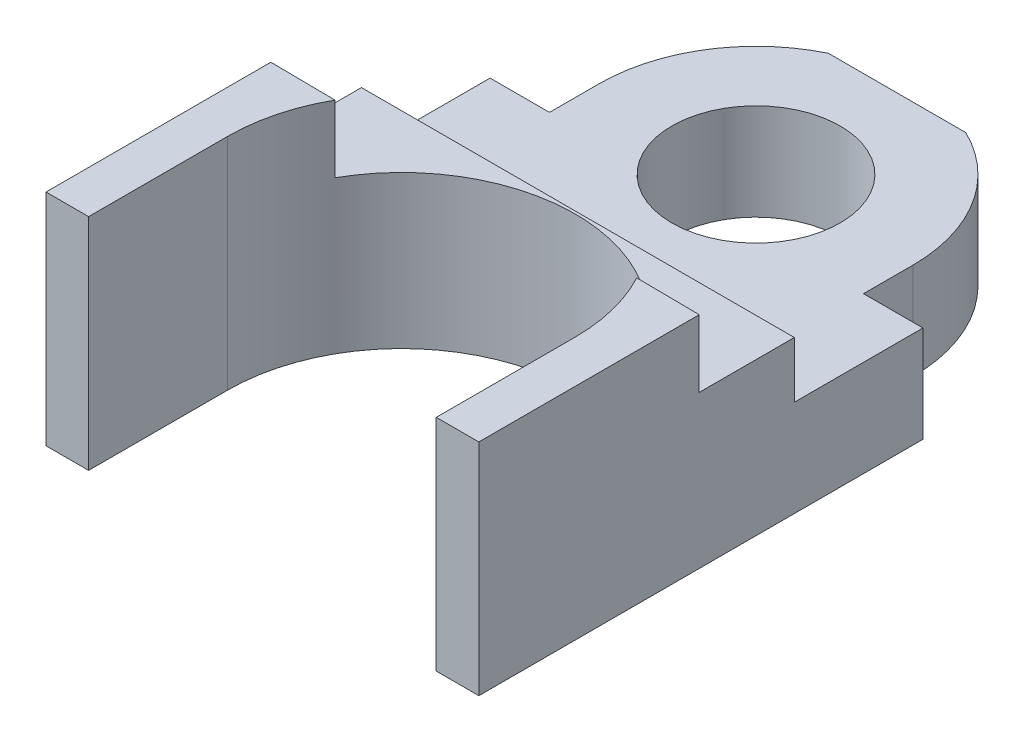
ISO-10303-21;
HEADER;
FILE_DESCRIPTION(('STEP AP214'),'2;1');
FILE_NAME('part.step','',(''),(''),'','','');
FILE_SCHEMA(('AUTOMOTIVE_DESIGN { 1 0 10303 214 1 1 1 1 }'));
ENDSEC;
DATA;
#1=APPLICATION_CONTEXT('core data for automotive mechanical design processes');
#2=APPLICATION_PROTOCOL_DEFINITION('international standard','automotive_design',2000,#1);
#3=PRODUCT_CONTEXT('',#1,'mechanical');
#4=PRODUCT('Part','Part','',(#3));
#5=PRODUCT_RELATED_PRODUCT_CATEGORY('part','',(#4));
#6=PRODUCT_DEFINITION_FORMATION('','',#4);
#7=PRODUCT_DEFINITION_CONTEXT('part definition',#1,'design');
#8=PRODUCT_DEFINITION('design','',#6,#7);
#9=PRODUCT_DEFINITION_SHAPE('','',#8);
#10=(LENGTH_UNIT() NAMED_UNIT(*) SI_UNIT(.MILLI.,.METRE.));
#11=(NAMED_UNIT(*) PLANE_ANGLE_UNIT() SI_UNIT($,.RADIAN.));
#12=(NAMED_UNIT(*) SI_UNIT($,.STERADIAN.) SOLID_ANGLE_UNIT());
#13=UNCERTAINTY_MEASURE_WITH_UNIT(LENGTH_MEASURE(1.E-05),#10,'distance_accuracy_value','');
#14=(GEOMETRIC_REPRESENTATION_CONTEXT(3) GLOBAL_UNCERTAINTY_ASSIGNED_CONTEXT((#13)) GLOBAL_UNIT_ASSIGNED_CONTEXT((#10,
#11,#12)) REPRESENTATION_CONTEXT('',''));
#15=CARTESIAN_POINT('',(0.,0.,0.));
#16=DIRECTION('',(0.,0.,1.));
#17=DIRECTION('',(1.,0.,0.));
#18=AXIS2_PLACEMENT_3D('',#15,#16,#17);
#19=CARTESIAN_POINT('',(0.,9.8,-5.73407202216066));
#20=DIRECTION('',(0.,0.,-1.));
#21=DIRECTION('',(-1.,0.,0.));
#22=AXIS2_PLACEMENT_3D('',#19,#20,#21);
#23=PLANE('',#22);
#24=DIRECTION('',(0.,-1.,0.));
#25=VECTOR('',#24,1.);
#26=CARTESIAN_POINT('',(11.5832409972299,9.8,-5.73407202216066));
#27=LINE('',#26,#25);
#28=CARTESIAN_POINT('',(11.5832409972299,4.3,-5.73407202216066));
#29=VERTEX_POINT('',#28);
#30=CARTESIAN_POINT('',(11.5832409972299,0.,-5.73407202216066));
#31=VERTEX_POINT('',#30);
#32=EDGE_CURVE('E322',#29,#31,#27,.T.);
#33=ORIENTED_EDGE('',*,*,#32,.F.);
#34=DIRECTION('',(1.,0.,0.));
#35=VECTOR('',#34,1.);
#36=CARTESIAN_POINT('',(0.,4.3,-5.73407202216066));
#37=LINE('',#36,#35);
#38=CARTESIAN_POINT('',(14.2332409972299,4.3,-5.73407202216066));
#39=VERTEX_POINT('',#38);
#40=EDGE_CURVE('E391',#29,#39,#37,.T.);
#41=ORIENTED_EDGE('',*,*,#40,.T.);
#42=DIRECTION('',(0.,-1.,0.));
#43=VECTOR('',#42,1.);
#44=CARTESIAN_POINT('',(14.2332409972299,9.8,-5.73407202216066));
#45=LINE('',#44,#43);
#46=CARTESIAN_POINT('',(14.2332409972299,0.,-5.73407202216066));
#47=VERTEX_POINT('',#46);
#48=EDGE_CURVE('E325',#39,#47,#45,.T.);
#49=ORIENTED_EDGE('',*,*,#48,.T.);
#50=DIRECTION('',(1.,0.,0.));
#51=VECTOR('',#50,1.);
#52=CARTESIAN_POINT('',(0.,0.,-5.73407202216066));
#53=LINE('',#52,#51);
#54=EDGE_CURVE('E255',#31,#47,#53,.T.);
#55=ORIENTED_EDGE('',*,*,#54,.F.);
#56=EDGE_LOOP('',(#33,#41,#49,#55));
#57=FACE_BOUND('',#56,.T.);
#58=ADVANCED_FACE('F39',(#57),#23,.T.);
#59=CARTESIAN_POINT('',(11.5832409972299,9.8,0.));
#60=DIRECTION('',(1.,0.,0.));
#61=DIRECTION('',(0.,0.,-1.));
#62=AXIS2_PLACEMENT_3D('',#59,#60,#61);
#63=PLANE('',#62);
#64=DIRECTION('',(0.,-1.,0.));
#65=VECTOR('',#64,1.);
#66=CARTESIAN_POINT('',(11.5832409972299,9.8,-7.9404432132964));
#67=LINE('',#66,#65);
#68=CARTESIAN_POINT('',(11.5832409972299,4.3,-7.9404432132964));
#69=VERTEX_POINT('',#68);
#70=CARTESIAN_POINT('',(11.5832409972299,0.,-7.9404432132964));
#71=VERTEX_POINT('',#70);
#72=EDGE_CURVE('E319',#69,#71,#67,.T.);
#73=ORIENTED_EDGE('',*,*,#72,.F.);
#74=DIRECTION('',(0.,0.,1.));
#75=VECTOR('',#74,1.);
#76=CARTESIAN_POINT('',(11.5832409972299,4.3,0.));
#77=LINE('',#76,#75);
#78=EDGE_CURVE('E395',#69,#29,#77,.T.);
#79=ORIENTED_EDGE('',*,*,#78,.T.);
#80=ORIENTED_EDGE('',*,*,#32,.T.);
#81=DIRECTION('',(0.,0.,1.));
#82=VECTOR('',#81,1.);
#83=CARTESIAN_POINT('',(11.5832409972299,0.,0.));
#84=LINE('',#83,#82);
#85=EDGE_CURVE('E259',#71,#31,#84,.T.);
#86=ORIENTED_EDGE('',*,*,#85,.F.);
#87=EDGE_LOOP('',(#73,#79,#80,#86));
#88=FACE_BOUND('',#87,.T.);
#89=ADVANCED_FACE('F444',(#88),#63,.T.);
#90=CARTESIAN_POINT('',(4.58324099722992,9.8,-7.9404432132964));
#91=DIRECTION('',(0.,-1.,0.));
#92=DIRECTION('',(0.,0.,-1.));
#93=AXIS2_PLACEMENT_3D('',#90,#91,#92);
#94=CYLINDRICAL_SURFACE('',#93,7.);
#95=CARTESIAN_POINT('',(4.58324099722992,4.3,-7.9404432132964));
#96=DIRECTION('',(0.,1.,0.));
#97=DIRECTION('',(0.,0.,1.));
#98=AXIS2_PLACEMENT_3D('',#95,#96,#97);
#99=CIRCLE('',#98,7.);
#100=CARTESIAN_POINT('',(7.64759026195706,4.3,-14.2340720221607));
#101=VERTEX_POINT('',#100);
#102=EDGE_CURVE('E399',#69,#101,#99,.T.);
#103=ORIENTED_EDGE('',*,*,#102,.F.);
#104=ORIENTED_EDGE('',*,*,#72,.T.);
#105=CARTESIAN_POINT('',(4.58324099722992,0.,-7.9404432132964));
#106=DIRECTION('',(0.,1.,0.));
#107=DIRECTION('',(0.,0.,1.));
#108=AXIS2_PLACEMENT_3D('',#105,#106,#107);
#109=CIRCLE('',#108,7.);
#110=CARTESIAN_POINT('',(7.64759026195706,0.,-14.2340720221607));
#111=VERTEX_POINT('',#110);
#112=EDGE_CURVE('E263',#71,#111,#109,.T.);
#113=ORIENTED_EDGE('',*,*,#112,.T.);
#114=DIRECTION('',(0.,-1.,0.));
#115=VECTOR('',#114,1.);
#116=CARTESIAN_POINT('',(7.64759026195706,9.8,-14.2340720221607));
#117=LINE('',#116,#115);
#118=EDGE_CURVE('E316',#101,#111,#117,.T.);
#119=ORIENTED_EDGE('',*,*,#118,.F.);
#120=EDGE_LOOP('',(#103,#104,#113,#119));
#121=FACE_BOUND('',#120,.T.);
#122=ADVANCED_FACE('F450',(#121),#94,.T.);
#123=CARTESIAN_POINT('',(0.,9.8,-14.2340720221607));
#124=DIRECTION('',(0.,0.,1.));
#125=DIRECTION('',(1.,0.,0.));
#126=AXIS2_PLACEMENT_3D('',#123,#124,#125);
#127=PLANE('',#126);
#128=DIRECTION('',(-1.,0.,0.));
#129=VECTOR('',#128,1.);
#130=CARTESIAN_POINT('',(0.,4.3,-14.2340720221607));
#131=LINE('',#130,#129);
#132=CARTESIAN_POINT('',(1.51889173250277,4.3,-14.2340720221607));
#133=VERTEX_POINT('',#132);
#134=EDGE_CURVE('E402',#101,#133,#131,.T.);
#135=ORIENTED_EDGE('',*,*,#134,.F.);
#136=ORIENTED_EDGE('',*,*,#118,.T.);
#137=DIRECTION('',(-1.,0.,0.));
#138=VECTOR('',#137,1.);
#139=CARTESIAN_POINT('',(0.,0.,-14.2340720221607));
#140=LINE('',#139,#138);
#141=CARTESIAN_POINT('',(1.51889173250277,0.,-14.2340720221607));
#142=VERTEX_POINT('',#141);
#143=EDGE_CURVE('E267',#111,#142,#140,.T.);
#144=ORIENTED_EDGE('',*,*,#143,.T.);
#145=DIRECTION('',(0.,-1.,0.));
#146=VECTOR('',#145,1.);
#147=CARTESIAN_POINT('',(1.51889173250277,9.8,-14.2340720221607));
#148=LINE('',#147,#146);
#149=EDGE_CURVE('E313',#133,#142,#148,.T.);
#150=ORIENTED_EDGE('',*,*,#149,.F.);
#151=EDGE_LOOP('',(#135,#136,#144,#150));
#152=FACE_BOUND('',#151,.T.);
#153=ADVANCED_FACE('F500',(#152),#127,.F.);
#154=CARTESIAN_POINT('',(4.58324099722992,9.8,-7.9404432132964));
#155=DIRECTION('',(0.,-1.,0.));
#156=DIRECTION('',(0.,0.,-1.));
#157=AXIS2_PLACEMENT_3D('',#154,#155,#156);
#158=CYLINDRICAL_SURFACE('',#157,7.);
#159=CARTESIAN_POINT('',(4.58324099722992,4.3,-7.9404432132964));
#160=DIRECTION('',(0.,1.,0.));
#161=DIRECTION('',(0.,0.,1.));
#162=AXIS2_PLACEMENT_3D('',#159,#160,#161);
#163=CIRCLE('',#162,7.);
#164=CARTESIAN_POINT('',(-2.41675900277008,4.3,-7.9404432132964));
#165=VERTEX_POINT('',#164);
#166=EDGE_CURVE('E405',#133,#165,#163,.T.);
#167=ORIENTED_EDGE('',*,*,#166,.F.);
#168=ORIENTED_EDGE('',*,*,#149,.T.);
#169=CARTESIAN_POINT('',(4.58324099722992,0.,-7.9404432132964));
#170=DIRECTION('',(0.,1.,0.));
#171=DIRECTION('',(0.,0.,1.));
#172=AXIS2_PLACEMENT_3D('',#169,#170,#171);
#173=CIRCLE('',#172,7.);
#174=CARTESIAN_POINT('',(-2.41675900277008,0.,-7.9404432132964));
#175=VERTEX_POINT('',#174);
#176=EDGE_CURVE('E271',#142,#175,#173,.T.);
#177=ORIENTED_EDGE('',*,*,#176,.T.);
#178=DIRECTION('',(0.,-1.,0.));
#179=VECTOR('',#178,1.);
#180=CARTESIAN_POINT('',(-2.41675900277008,9.8,-7.9404432132964));
#181=LINE('',#180,#179);
#182=EDGE_CURVE('E310',#165,#175,#181,.T.);
#183=ORIENTED_EDGE('',*,*,#182,.F.);
#184=EDGE_LOOP('',(#167,#168,#177,#183));
#185=FACE_BOUND('',#184,.T.);
#186=ADVANCED_FACE('F496',(#185),#158,.T.);
#187=CARTESIAN_POINT('',(-2.41675900277008,9.8,0.));
#188=DIRECTION('',(1.,0.,0.));
#189=DIRECTION('',(0.,0.,-1.));
#190=AXIS2_PLACEMENT_3D('',#187,#188,#189);
#191=PLANE('',#190);
#192=DIRECTION('',(0.,0.,1.));
#193=VECTOR('',#192,1.);
#194=CARTESIAN_POINT('',(-2.41675900277008,4.3,0.));
#195=LINE('',#194,#193);
#196=CARTESIAN_POINT('',(-2.41675900277008,4.3,-5.73407202216066));
#197=VERTEX_POINT('',#196);
#198=EDGE_CURVE('E408',#165,#197,#195,.T.);
#199=ORIENTED_EDGE('',*,*,#198,.F.);
#200=ORIENTED_EDGE('',*,*,#182,.T.);
#201=DIRECTION('',(0.,0.,1.));
#202=VECTOR('',#201,1.);
#203=CARTESIAN_POINT('',(-2.41675900277008,0.,0.));
#204=LINE('',#203,#202);
#205=CARTESIAN_POINT('',(-2.41675900277008,0.,-5.73407202216066));
#206=VERTEX_POINT('',#205);
#207=EDGE_CURVE('E275',#175,#206,#204,.T.);
#208=ORIENTED_EDGE('',*,*,#207,.T.);
#209=DIRECTION('',(0.,-1.,0.));
#210=VECTOR('',#209,1.);
#211=CARTESIAN_POINT('',(-2.41675900277008,9.8,-5.73407202216066));
#212=LINE('',#211,#210);
#213=EDGE_CURVE('E307',#197,#206,#212,.T.);
#214=ORIENTED_EDGE('',*,*,#213,.F.);
#215=EDGE_LOOP('',(#199,#200,#208,#214));
#216=FACE_BOUND('',#215,.T.);
#217=ADVANCED_FACE('F492',(#216),#191,.F.);
#218=CARTESIAN_POINT('',(0.,9.8,-5.73407202216066));
#219=DIRECTION('',(0.,0.,-1.));
#220=DIRECTION('',(-1.,0.,0.));
#221=AXIS2_PLACEMENT_3D('',#218,#219,#220);
#222=PLANE('',#221);
#223=DIRECTION('',(0.,-1.,0.));
#224=VECTOR('',#223,1.);
#225=CARTESIAN_POINT('',(-5.06675900277009,9.8,-5.73407202216066));
#226=LINE('',#225,#224);
#227=CARTESIAN_POINT('',(-5.06675900277009,4.3,-5.73407202216066));
#228=VERTEX_POINT('',#227);
#229=CARTESIAN_POINT('',(-5.06675900277009,0.,-5.73407202216066));
#230=VERTEX_POINT('',#229);
#231=EDGE_CURVE('E304',#228,#230,#226,.T.);
#232=ORIENTED_EDGE('',*,*,#231,.F.);
#233=DIRECTION('',(1.,0.,0.));
#234=VECTOR('',#233,1.);
#235=CARTESIAN_POINT('',(0.,4.3,-5.73407202216066));
#236=LINE('',#235,#234);
#237=EDGE_CURVE('E411',#228,#197,#236,.T.);
#238=ORIENTED_EDGE('',*,*,#237,.T.);
#239=ORIENTED_EDGE('',*,*,#213,.T.);
#240=DIRECTION('',(1.,0.,0.));
#241=VECTOR('',#240,1.);
#242=CARTESIAN_POINT('',(0.,0.,-5.73407202216066));
#243=LINE('',#242,#241);
#244=EDGE_CURVE('E279',#230,#206,#243,.T.);
#245=ORIENTED_EDGE('',*,*,#244,.F.);
#246=EDGE_LOOP('',(#232,#238,#239,#245));
#247=FACE_BOUND('',#246,.T.);
#248=ADVANCED_FACE('F471',(#247),#222,.T.);
#249=CARTESIAN_POINT('',(4.58324099722992,9.8,-7.9404432132964));
#250=DIRECTION('',(0.,-1.,0.));
#251=DIRECTION('',(0.,0.,-1.));
#252=AXIS2_PLACEMENT_3D('',#249,#250,#251);
#253=CYLINDRICAL_SURFACE('',#252,3.75);
#254=CARTESIAN_POINT('',(4.58324099722992,0.,-7.9404432132964));
#255=DIRECTION('',(0.,1.,0.));
#256=DIRECTION('',(0.,0.,1.));
#257=AXIS2_PLACEMENT_3D('',#254,#255,#256);
#258=CIRCLE('',#257,3.75);
#259=CARTESIAN_POINT('',(4.58324099722992,0.,-4.1904432132964));
#260=VERTEX_POINT('',#259);
#261=EDGE_CURVE('E202',#260,#260,#258,.T.);
#262=ORIENTED_EDGE('',*,*,#261,.F.);
#263=EDGE_LOOP('',(#262));
#264=FACE_BOUND('',#263,.T.);
#265=CARTESIAN_POINT('',(4.58324099722992,4.3,-7.9404432132964));
#266=DIRECTION('',(0.,1.,0.));
#267=DIRECTION('',(0.,0.,1.));
#268=AXIS2_PLACEMENT_3D('',#265,#266,#267);
#269=CIRCLE('',#268,3.75);
#270=CARTESIAN_POINT('',(4.58324099722992,4.3,-4.1904432132964));
#271=VERTEX_POINT('',#270);
#272=EDGE_CURVE('E43',#271,#271,#269,.T.);
#273=ORIENTED_EDGE('',*,*,#272,.T.);
#274=EDGE_LOOP('',(#273));
#275=FACE_BOUND('',#274,.T.);
#276=ADVANCED_FACE('F41',(#264,#275),#253,.F.);
#277=CARTESIAN_POINT('',(0.,9.8,0.));
#278=DIRECTION('',(0.,1.,0.));
#279=DIRECTION('',(0.,0.,1.));
#280=AXIS2_PLACEMENT_3D('',#277,#278,#279);
#281=PLANE('',#280);
#282=DIRECTION('',(0.999947175250382,0.,0.01027845848275));
#283=VECTOR('',#282,1.);
#284=CARTESIAN_POINT('',(-0.0420797286511879,9.8,4.09375645877981));
#285=LINE('',#284,#283);
#286=CARTESIAN_POINT('',(-5.06675900277009,9.8,4.04210777314276));
#287=VERTEX_POINT('',#286);
#288=CARTESIAN_POINT('',(-2.17514140550939,9.8,4.07183071467114));
#289=VERTEX_POINT('',#288);
#290=EDGE_CURVE('E49',#287,#289,#285,.T.);
#291=ORIENTED_EDGE('',*,*,#290,.F.);
#292=DIRECTION('',(0.,0.,1.));
#293=VECTOR('',#292,1.);
#294=CARTESIAN_POINT('',(-5.06675900277009,9.8,0.));
#295=LINE('',#294,#293);
#296=CARTESIAN_POINT('',(-5.06675900277008,9.8,14.0659279778393));
#297=VERTEX_POINT('',#296);
#298=EDGE_CURVE('E225',#287,#297,#295,.T.);
#299=ORIENTED_EDGE('',*,*,#298,.T.);
#300=DIRECTION('',(1.,0.,0.));
#301=VECTOR('',#300,1.);
#302=CARTESIAN_POINT('',(0.,9.8,14.0659279778393));
#303=LINE('',#302,#301);
#304=CARTESIAN_POINT('',(-3.16675900277008,9.8,14.0659279778393));
#305=VERTEX_POINT('',#304);
#306=EDGE_CURVE('E228',#297,#305,#303,.T.);
#307=ORIENTED_EDGE('',*,*,#306,.T.);
#308=DIRECTION('',(0.,0.,1.));
#309=VECTOR('',#308,1.);
#310=CARTESIAN_POINT('',(-3.16675900277008,9.8,0.));
#311=LINE('',#310,#309);
#312=CARTESIAN_POINT('',(-3.16675900277008,9.8,7.86481994459839));
#313=VERTEX_POINT('',#312);
#314=EDGE_CURVE('E231',#313,#305,#311,.T.);
#315=ORIENTED_EDGE('',*,*,#314,.F.);
#316=CARTESIAN_POINT('',(4.58324099722992,9.8,7.86481994459834));
#317=DIRECTION('',(0.,1.,0.));
#318=DIRECTION('',(0.,0.,1.));
#319=AXIS2_PLACEMENT_3D('',#316,#317,#318);
#320=CIRCLE('',#319,7.75);
#321=EDGE_CURVE('E213',#289,#313,#320,.T.);
#322=ORIENTED_EDGE('',*,*,#321,.F.);
#323=EDGE_LOOP('',(#291,#299,#307,#315,#322));
#324=FACE_BOUND('',#323,.T.);
#325=ADVANCED_FACE('F359',(#324),#281,.T.);
#326=CARTESIAN_POINT('',(4.58324099722992,9.8,7.86481994459834));
#327=DIRECTION('',(0.,-1.,0.));
#328=DIRECTION('',(0.,0.,-1.));
#329=AXIS2_PLACEMENT_3D('',#326,#327,#328);
#330=CYLINDRICAL_SURFACE('',#329,7.75);
#331=DIRECTION('',(0.,-1.,0.));
#332=VECTOR('',#331,1.);
#333=CARTESIAN_POINT('',(-2.17514140550939,9.8,4.07183071467114));
#334=LINE('',#333,#332);
#335=CARTESIAN_POINT('',(-2.17514140550939,6.8,4.07183071467114));
#336=VERTEX_POINT('',#335);
#337=EDGE_CURVE('E204',#289,#336,#334,.T.);
#338=ORIENTED_EDGE('',*,*,#337,.F.);
#339=ORIENTED_EDGE('',*,*,#321,.T.);
#340=DIRECTION('',(0.,-1.,0.));
#341=VECTOR('',#340,1.);
#342=CARTESIAN_POINT('',(-3.16675900277008,9.8,7.86481994459839));
#343=LINE('',#342,#341);
#344=CARTESIAN_POINT('',(-3.16675900277008,0.,7.86481994459839));
#345=VERTEX_POINT('',#344);
#346=EDGE_CURVE('E235',#313,#345,#343,.T.);
#347=ORIENTED_EDGE('',*,*,#346,.T.);
#348=CARTESIAN_POINT('',(4.58324099722992,0.,7.86481994459834));
#349=DIRECTION('',(0.,1.,0.));
#350=DIRECTION('',(0.,0.,1.));
#351=AXIS2_PLACEMENT_3D('',#348,#349,#350);
#352=CIRCLE('',#351,7.75);
#353=CARTESIAN_POINT('',(12.3332409972299,0.,7.86481994459834));
#354=VERTEX_POINT('',#353);
#355=EDGE_CURVE('E239',#354,#345,#352,.T.);
#356=ORIENTED_EDGE('',*,*,#355,.F.);
#357=DIRECTION('',(0.,-1.,0.));
#358=VECTOR('',#357,1.);
#359=CARTESIAN_POINT('',(12.3332409972299,9.8,7.86481994459834));
#360=LINE('',#359,#358);
#361=CARTESIAN_POINT('',(12.3332409972299,9.8,7.86481994459834));
#362=VERTEX_POINT('',#361);
#363=EDGE_CURVE('E336',#362,#354,#360,.T.);
#364=ORIENTED_EDGE('',*,*,#363,.F.);
#365=CARTESIAN_POINT('',(11.4181634440447,9.8,4.21155631518051));
#366=VERTEX_POINT('',#365);
#367=EDGE_CURVE('E208',#362,#366,#320,.T.);
#368=ORIENTED_EDGE('',*,*,#367,.T.);
#369=DIRECTION('',(0.,-1.,0.));
#370=VECTOR('',#369,1.);
#371=CARTESIAN_POINT('',(11.4181634440447,9.8,4.21155631518051));
#372=LINE('',#371,#370);
#373=CARTESIAN_POINT('',(11.4181634440447,6.8,4.21155631518051));
#374=VERTEX_POINT('',#373);
#375=EDGE_CURVE('E63',#374,#366,#372,.F.);
#376=ORIENTED_EDGE('',*,*,#375,.F.);
#377=CARTESIAN_POINT('',(4.58324099722992,6.8,7.86481994459834));
#378=DIRECTION('',(0.,-1.,0.));
#379=DIRECTION('',(0.,0.,-1.));
#380=AXIS2_PLACEMENT_3D('',#377,#378,#379);
#381=CIRCLE('',#380,7.75);
#382=EDGE_CURVE('E197',#336,#374,#381,.T.);
#383=ORIENTED_EDGE('',*,*,#382,.F.);
#384=EDGE_LOOP('',(#338,#339,#347,#356,#364,#368,#376,#383));
#385=FACE_BOUND('',#384,.T.);
#386=ADVANCED_FACE('F355',(#385),#330,.F.);
#387=CARTESIAN_POINT('',(12.3332409972299,9.8,0.));
#388=DIRECTION('',(1.,0.,0.));
#389=DIRECTION('',(0.,0.,-1.));
#390=AXIS2_PLACEMENT_3D('',#387,#388,#389);
#391=PLANE('',#390);
#392=DIRECTION('',(0.,0.,1.));
#393=VECTOR('',#392,1.);
#394=CARTESIAN_POINT('',(12.3332409972299,0.,0.));
#395=LINE('',#394,#393);
#396=CARTESIAN_POINT('',(12.3332409972299,0.,14.0659279778393));
#397=VERTEX_POINT('',#396);
#398=EDGE_CURVE('E243',#354,#397,#395,.T.);
#399=ORIENTED_EDGE('',*,*,#398,.T.);
#400=DIRECTION('',(0.,-1.,0.));
#401=VECTOR('',#400,1.);
#402=CARTESIAN_POINT('',(12.3332409972299,9.8,14.0659279778393));
#403=LINE('',#402,#401);
#404=CARTESIAN_POINT('',(12.3332409972299,9.8,14.0659279778393));
#405=VERTEX_POINT('',#404);
#406=EDGE_CURVE('E332',#405,#397,#403,.T.);
#407=ORIENTED_EDGE('',*,*,#406,.F.);
#408=DIRECTION('',(0.,0.,1.));
#409=VECTOR('',#408,1.);
#410=CARTESIAN_POINT('',(12.3332409972299,9.8,0.));
#411=LINE('',#410,#409);
#412=EDGE_CURVE('E212',#362,#405,#411,.T.);
#413=ORIENTED_EDGE('',*,*,#412,.F.);
#414=ORIENTED_EDGE('',*,*,#363,.T.);
#415=EDGE_LOOP('',(#399,#407,#413,#414));
#416=FACE_BOUND('',#415,.T.);
#417=ADVANCED_FACE('F372',(#416),#391,.F.);
#418=CARTESIAN_POINT('',(0.,9.8,14.0659279778393));
#419=DIRECTION('',(0.,0.,-1.));
#420=DIRECTION('',(-1.,0.,0.));
#421=AXIS2_PLACEMENT_3D('',#418,#419,#420);
#422=PLANE('',#421);
#423=DIRECTION('',(1.,0.,0.));
#424=VECTOR('',#423,1.);
#425=CARTESIAN_POINT('',(0.,0.,14.0659279778393));
#426=LINE('',#425,#424);
#427=CARTESIAN_POINT('',(14.2332409972299,0.,14.0659279778393));
#428=VERTEX_POINT('',#427);
#429=EDGE_CURVE('E247',#397,#428,#426,.T.);
#430=ORIENTED_EDGE('',*,*,#429,.T.);
#431=DIRECTION('',(0.,-1.,0.));
#432=VECTOR('',#431,1.);
#433=CARTESIAN_POINT('',(14.2332409972299,9.8,14.0659279778393));
#434=LINE('',#433,#432);
#435=CARTESIAN_POINT('',(14.2332409972299,9.8,14.0659279778393));
#436=VERTEX_POINT('',#435);
#437=EDGE_CURVE('E328',#436,#428,#434,.T.);
#438=ORIENTED_EDGE('',*,*,#437,.F.);
#439=DIRECTION('',(1.,0.,0.));
#440=VECTOR('',#439,1.);
#441=CARTESIAN_POINT('',(0.,9.8,14.0659279778393));
#442=LINE('',#441,#440);
#443=EDGE_CURVE('E217',#405,#436,#442,.T.);
#444=ORIENTED_EDGE('',*,*,#443,.F.);
#445=ORIENTED_EDGE('',*,*,#406,.T.);
#446=EDGE_LOOP('',(#430,#438,#444,#445));
#447=FACE_BOUND('',#446,.T.);
#448=ADVANCED_FACE('F458',(#447),#422,.F.);
#449=CARTESIAN_POINT('',(14.2332409972299,9.8,0.));
#450=DIRECTION('',(-1.,0.,0.));
#451=DIRECTION('',(0.,0.,1.));
#452=AXIS2_PLACEMENT_3D('',#449,#450,#451);
#453=PLANE('',#452);
#454=DIRECTION('',(0.,0.,-1.));
#455=VECTOR('',#454,1.);
#456=CARTESIAN_POINT('',(14.2332409972299,4.3,0.));
#457=LINE('',#456,#455);
#458=CARTESIAN_POINT('',(14.2332409972299,4.3,0.));
#459=VERTEX_POINT('',#458);
#460=EDGE_CURVE('E190',#459,#39,#457,.T.);
#461=ORIENTED_EDGE('',*,*,#460,.F.);
#462=DIRECTION('',(0.,1.,0.));
#463=VECTOR('',#462,1.);
#464=CARTESIAN_POINT('',(14.2332409972299,9.8,0.));
#465=LINE('',#464,#463);
#466=CARTESIAN_POINT('',(14.2332409972299,6.8,0.));
#467=VERTEX_POINT('',#466);
#468=EDGE_CURVE('E178',#459,#467,#465,.T.);
#469=ORIENTED_EDGE('',*,*,#468,.T.);
#470=DIRECTION('',(0.,0.,1.));
#471=VECTOR('',#470,1.);
#472=CARTESIAN_POINT('',(14.2332409972299,6.8,0.));
#473=LINE('',#472,#471);
#474=CARTESIAN_POINT('',(14.2332409972299,6.8,4.24049250148344));
#475=VERTEX_POINT('',#474);
#476=EDGE_CURVE('E187',#467,#475,#473,.T.);
#477=ORIENTED_EDGE('',*,*,#476,.T.);
#478=DIRECTION('',(0.,1.,0.));
#479=VECTOR('',#478,1.);
#480=CARTESIAN_POINT('',(14.2332409972299,9.8,4.24049250148344));
#481=LINE('',#480,#479);
#482=CARTESIAN_POINT('',(14.2332409972299,9.8,4.24049250148344));
#483=VERTEX_POINT('',#482);
#484=EDGE_CURVE('E378',#475,#483,#481,.T.);
#485=ORIENTED_EDGE('',*,*,#484,.T.);
#486=DIRECTION('',(0.,0.,-1.));
#487=VECTOR('',#486,1.);
#488=CARTESIAN_POINT('',(14.2332409972299,9.8,0.));
#489=LINE('',#488,#487);
#490=EDGE_CURVE('E221',#436,#483,#489,.T.);
#491=ORIENTED_EDGE('',*,*,#490,.F.);
#492=ORIENTED_EDGE('',*,*,#437,.T.);
#493=DIRECTION('',(0.,0.,-1.));
#494=VECTOR('',#493,1.);
#495=CARTESIAN_POINT('',(14.2332409972299,0.,0.));
#496=LINE('',#495,#494);
#497=EDGE_CURVE('E251',#428,#47,#496,.T.);
#498=ORIENTED_EDGE('',*,*,#497,.T.);
#499=ORIENTED_EDGE('',*,*,#48,.F.);
#500=EDGE_LOOP('',(#461,#469,#477,#485,#491,#492,#498,#499));
#501=FACE_BOUND('',#500,.T.);
#502=ADVANCED_FACE('F185',(#501),#453,.F.);
#503=CARTESIAN_POINT('',(-5.06675900277009,9.8,0.));
#504=DIRECTION('',(1.,0.,0.));
#505=DIRECTION('',(0.,0.,-1.));
#506=AXIS2_PLACEMENT_3D('',#503,#504,#505);
#507=PLANE('',#506);
#508=DIRECTION('',(0.,0.,-1.));
#509=VECTOR('',#508,1.);
#510=CARTESIAN_POINT('',(-5.06675900277009,6.8,0.));
#511=LINE('',#510,#509);
#512=CARTESIAN_POINT('',(-5.06675900277008,6.8,4.04210777314276));
#513=VERTEX_POINT('',#512);
#514=CARTESIAN_POINT('',(-5.06675900277009,6.8,0.));
#515=VERTEX_POINT('',#514);
#516=EDGE_CURVE('E198',#513,#515,#511,.T.);
#517=ORIENTED_EDGE('',*,*,#516,.T.);
#518=DIRECTION('',(0.,-1.,0.));
#519=VECTOR('',#518,1.);
#520=CARTESIAN_POINT('',(-5.06675900277009,9.8,0.));
#521=LINE('',#520,#519);
#522=CARTESIAN_POINT('',(-5.06675900277009,4.3,0.));
#523=VERTEX_POINT('',#522);
#524=EDGE_CURVE('E56',#515,#523,#521,.T.);
#525=ORIENTED_EDGE('',*,*,#524,.T.);
#526=DIRECTION('',(0.,0.,1.));
#527=VECTOR('',#526,1.);
#528=CARTESIAN_POINT('',(-5.06675900277009,4.3,0.));
#529=LINE('',#528,#527);
#530=EDGE_CURVE('E415',#228,#523,#529,.T.);
#531=ORIENTED_EDGE('',*,*,#530,.F.);
#532=ORIENTED_EDGE('',*,*,#231,.T.);
#533=DIRECTION('',(0.,0.,1.));
#534=VECTOR('',#533,1.);
#535=CARTESIAN_POINT('',(-5.06675900277009,0.,0.));
#536=LINE('',#535,#534);
#537=CARTESIAN_POINT('',(-5.06675900277008,0.,14.0659279778393));
#538=VERTEX_POINT('',#537);
#539=EDGE_CURVE('E283',#230,#538,#536,.T.);
#540=ORIENTED_EDGE('',*,*,#539,.T.);
#541=DIRECTION('',(0.,-1.,0.));
#542=VECTOR('',#541,1.);
#543=CARTESIAN_POINT('',(-5.06675900277008,9.8,14.0659279778393));
#544=LINE('',#543,#542);
#545=EDGE_CURVE('E300',#297,#538,#544,.T.);
#546=ORIENTED_EDGE('',*,*,#545,.F.);
#547=ORIENTED_EDGE('',*,*,#298,.F.);
#548=DIRECTION('',(0.,-1.,0.));
#549=VECTOR('',#548,1.);
#550=CARTESIAN_POINT('',(-5.06675900277008,9.8,4.04210777314276));
#551=LINE('',#550,#549);
#552=EDGE_CURVE('E349',#287,#513,#551,.T.);
#553=ORIENTED_EDGE('',*,*,#552,.T.);
#554=EDGE_LOOP('',(#517,#525,#531,#532,#540,#546,#547,#553));
#555=FACE_BOUND('',#554,.T.);
#556=ADVANCED_FACE('F426',(#555),#507,.F.);
#557=CARTESIAN_POINT('',(0.,9.8,14.0659279778393));
#558=DIRECTION('',(0.,0.,-1.));
#559=DIRECTION('',(-1.,0.,0.));
#560=AXIS2_PLACEMENT_3D('',#557,#558,#559);
#561=PLANE('',#560);
#562=DIRECTION('',(1.,0.,0.));
#563=VECTOR('',#562,1.);
#564=CARTESIAN_POINT('',(0.,0.,14.0659279778393));
#565=LINE('',#564,#563);
#566=CARTESIAN_POINT('',(-3.16675900277008,0.,14.0659279778393));
#567=VERTEX_POINT('',#566);
#568=EDGE_CURVE('E287',#538,#567,#565,.T.);
#569=ORIENTED_EDGE('',*,*,#568,.T.);
#570=DIRECTION('',(0.,-1.,0.));
#571=VECTOR('',#570,1.);
#572=CARTESIAN_POINT('',(-3.16675900277008,9.8,14.0659279778393));
#573=LINE('',#572,#571);
#574=EDGE_CURVE('E297',#305,#567,#573,.T.);
#575=ORIENTED_EDGE('',*,*,#574,.F.);
#576=ORIENTED_EDGE('',*,*,#306,.F.);
#577=ORIENTED_EDGE('',*,*,#545,.T.);
#578=EDGE_LOOP('',(#569,#575,#576,#577));
#579=FACE_BOUND('',#578,.T.);
#580=ADVANCED_FACE('F480',(#579),#561,.F.);
#581=CARTESIAN_POINT('',(-3.16675900277008,9.8,0.));
#582=DIRECTION('',(1.,0.,0.));
#583=DIRECTION('',(0.,0.,-1.));
#584=AXIS2_PLACEMENT_3D('',#581,#582,#583);
#585=PLANE('',#584);
#586=DIRECTION('',(0.,0.,1.));
#587=VECTOR('',#586,1.);
#588=CARTESIAN_POINT('',(-3.16675900277008,0.,0.));
#589=LINE('',#588,#587);
#590=EDGE_CURVE('E291',#345,#567,#589,.T.);
#591=ORIENTED_EDGE('',*,*,#590,.F.);
#592=ORIENTED_EDGE('',*,*,#346,.F.);
#593=ORIENTED_EDGE('',*,*,#314,.T.);
#594=ORIENTED_EDGE('',*,*,#574,.T.);
#595=EDGE_LOOP('',(#591,#592,#593,#594));
#596=FACE_BOUND('',#595,.T.);
#597=ADVANCED_FACE('F365',(#596),#585,.T.);
#598=EDGE_CURVE('E339',#366,#483,#285,.T.);
#599=ORIENTED_EDGE('',*,*,#598,.F.);
#600=ORIENTED_EDGE('',*,*,#367,.F.);
#601=ORIENTED_EDGE('',*,*,#412,.T.);
#602=ORIENTED_EDGE('',*,*,#443,.T.);
#603=ORIENTED_EDGE('',*,*,#490,.T.);
#604=EDGE_LOOP('',(#599,#600,#601,#602,#603));
#605=FACE_BOUND('',#604,.T.);
#606=ADVANCED_FACE('F376',(#605),#281,.T.);
#607=CARTESIAN_POINT('',(0.,0.,0.));
#608=DIRECTION('',(0.,1.,0.));
#609=DIRECTION('',(0.,0.,1.));
#610=AXIS2_PLACEMENT_3D('',#607,#608,#609);
#611=PLANE('',#610);
#612=ORIENTED_EDGE('',*,*,#261,.T.);
#613=EDGE_LOOP('',(#612));
#614=FACE_BOUND('',#613,.T.);
#615=ORIENTED_EDGE('',*,*,#355,.T.);
#616=ORIENTED_EDGE('',*,*,#590,.T.);
#617=ORIENTED_EDGE('',*,*,#568,.F.);
#618=ORIENTED_EDGE('',*,*,#539,.F.);
#619=ORIENTED_EDGE('',*,*,#244,.T.);
#620=ORIENTED_EDGE('',*,*,#207,.F.);
#621=ORIENTED_EDGE('',*,*,#176,.F.);
#622=ORIENTED_EDGE('',*,*,#143,.F.);
#623=ORIENTED_EDGE('',*,*,#112,.F.);
#624=ORIENTED_EDGE('',*,*,#85,.T.);
#625=ORIENTED_EDGE('',*,*,#54,.T.);
#626=ORIENTED_EDGE('',*,*,#497,.F.);
#627=ORIENTED_EDGE('',*,*,#429,.F.);
#628=ORIENTED_EDGE('',*,*,#398,.F.);
#629=EDGE_LOOP('',(#615,#616,#617,#618,#619,#620,#621,#622,#623,#624,#625,#626,#627,#628));
#630=FACE_BOUND('',#629,.T.);
#631=ADVANCED_FACE('F369',(#614,#630),#611,.F.);
#632=CARTESIAN_POINT('',(0.,6.8,0.));
#633=DIRECTION('',(0.,-1.,0.));
#634=DIRECTION('',(0.,0.,-1.));
#635=AXIS2_PLACEMENT_3D('',#632,#633,#634);
#636=PLANE('',#635);
#637=ORIENTED_EDGE('',*,*,#476,.F.);
#638=DIRECTION('',(-1.,0.,0.));
#639=VECTOR('',#638,1.);
#640=CARTESIAN_POINT('',(0.,6.8,0.));
#641=LINE('',#640,#639);
#642=EDGE_CURVE('E11',#467,#515,#641,.T.);
#643=ORIENTED_EDGE('',*,*,#642,.T.);
#644=ORIENTED_EDGE('',*,*,#516,.F.);
#645=DIRECTION('',(0.999947175250382,0.,0.01027845848275));
#646=VECTOR('',#645,1.);
#647=CARTESIAN_POINT('',(-7.57883820055991,6.8,4.01628610737987));
#648=LINE('',#647,#646);
#649=EDGE_CURVE('E384',#513,#336,#648,.T.);
#650=ORIENTED_EDGE('',*,*,#649,.T.);
#651=ORIENTED_EDGE('',*,*,#382,.T.);
#652=EDGE_CURVE('E195',#374,#475,#648,.T.);
#653=ORIENTED_EDGE('',*,*,#652,.T.);
#654=EDGE_LOOP('',(#637,#643,#644,#650,#651,#653));
#655=FACE_BOUND('',#654,.T.);
#656=ADVANCED_FACE('F194',(#655),#636,.F.);
#657=CARTESIAN_POINT('',(-7.57883820055991,6.8,4.01628610737987));
#658=DIRECTION('',(-0.01027845848275,0.,0.999947175250382));
#659=DIRECTION('',(0.999947175250382,0.,0.01027845848275));
#660=AXIS2_PLACEMENT_3D('',#657,#658,#659);
#661=PLANE('',#660);
#662=ORIENTED_EDGE('',*,*,#337,.T.);
#663=ORIENTED_EDGE('',*,*,#649,.F.);
#664=ORIENTED_EDGE('',*,*,#552,.F.);
#665=ORIENTED_EDGE('',*,*,#290,.T.);
#666=EDGE_LOOP('',(#662,#663,#664,#665));
#667=FACE_BOUND('',#666,.T.);
#668=ADVANCED_FACE('F345',(#667),#661,.F.);
#669=ORIENTED_EDGE('',*,*,#375,.T.);
#670=ORIENTED_EDGE('',*,*,#598,.T.);
#671=ORIENTED_EDGE('',*,*,#484,.F.);
#672=ORIENTED_EDGE('',*,*,#652,.F.);
#673=EDGE_LOOP('',(#669,#670,#671,#672));
#674=FACE_BOUND('',#673,.T.);
#675=ADVANCED_FACE('F435',(#674),#661,.F.);
#676=CARTESIAN_POINT('',(0.,4.3,0.));
#677=DIRECTION('',(0.,1.,0.));
#678=DIRECTION('',(0.,0.,1.));
#679=AXIS2_PLACEMENT_3D('',#676,#677,#678);
#680=PLANE('',#679);
#681=ORIENTED_EDGE('',*,*,#272,.F.);
#682=EDGE_LOOP('',(#681));
#683=FACE_BOUND('',#682,.T.);
#684=ORIENTED_EDGE('',*,*,#460,.T.);
#685=ORIENTED_EDGE('',*,*,#40,.F.);
#686=ORIENTED_EDGE('',*,*,#78,.F.);
#687=ORIENTED_EDGE('',*,*,#102,.T.);
#688=ORIENTED_EDGE('',*,*,#134,.T.);
#689=ORIENTED_EDGE('',*,*,#166,.T.);
#690=ORIENTED_EDGE('',*,*,#198,.T.);
#691=ORIENTED_EDGE('',*,*,#237,.F.);
#692=ORIENTED_EDGE('',*,*,#530,.T.);
#693=DIRECTION('',(1.,0.,0.));
#694=VECTOR('',#693,1.);
#695=CARTESIAN_POINT('',(-9.7506380573081,4.3,0.));
#696=LINE('',#695,#694);
#697=EDGE_CURVE('E420',#523,#459,#696,.T.);
#698=ORIENTED_EDGE('',*,*,#697,.T.);
#699=EDGE_LOOP('',(#684,#685,#686,#687,#688,#689,#690,#691,#692,#698));
#700=FACE_BOUND('',#699,.T.);
#701=ADVANCED_FACE('F423',(#683,#700),#680,.T.);
#702=CARTESIAN_POINT('',(-9.7506380573081,4.3,0.));
#703=DIRECTION('',(0.,0.,1.));
#704=DIRECTION('',(1.,0.,0.));
#705=AXIS2_PLACEMENT_3D('',#702,#703,#704);
#706=PLANE('',#705);
#707=ORIENTED_EDGE('',*,*,#697,.F.);
#708=ORIENTED_EDGE('',*,*,#524,.F.);
#709=ORIENTED_EDGE('',*,*,#642,.F.);
#710=ORIENTED_EDGE('',*,*,#468,.F.);
#711=EDGE_LOOP('',(#707,#708,#709,#710));
#712=FACE_BOUND('',#711,.T.);
#713=ADVANCED_FACE('F177',(#712),#706,.F.);
#714=CLOSED_SHELL('',(#58,#89,#122,#153,#186,#217,#248,#276,#325,#386,#417,#448,#502,#556,#580,
#597,#606,#631,#656,#668,#675,#701,#713));
#715=MANIFOLD_SOLID_BREP('B2',#714);
#716=ADVANCED_BREP_SHAPE_REPRESENTATION('',(#18,#715),#14);
#717=SHAPE_DEFINITION_REPRESENTATION(#9,#716);
ENDSEC;
END-ISO-10303-21;
